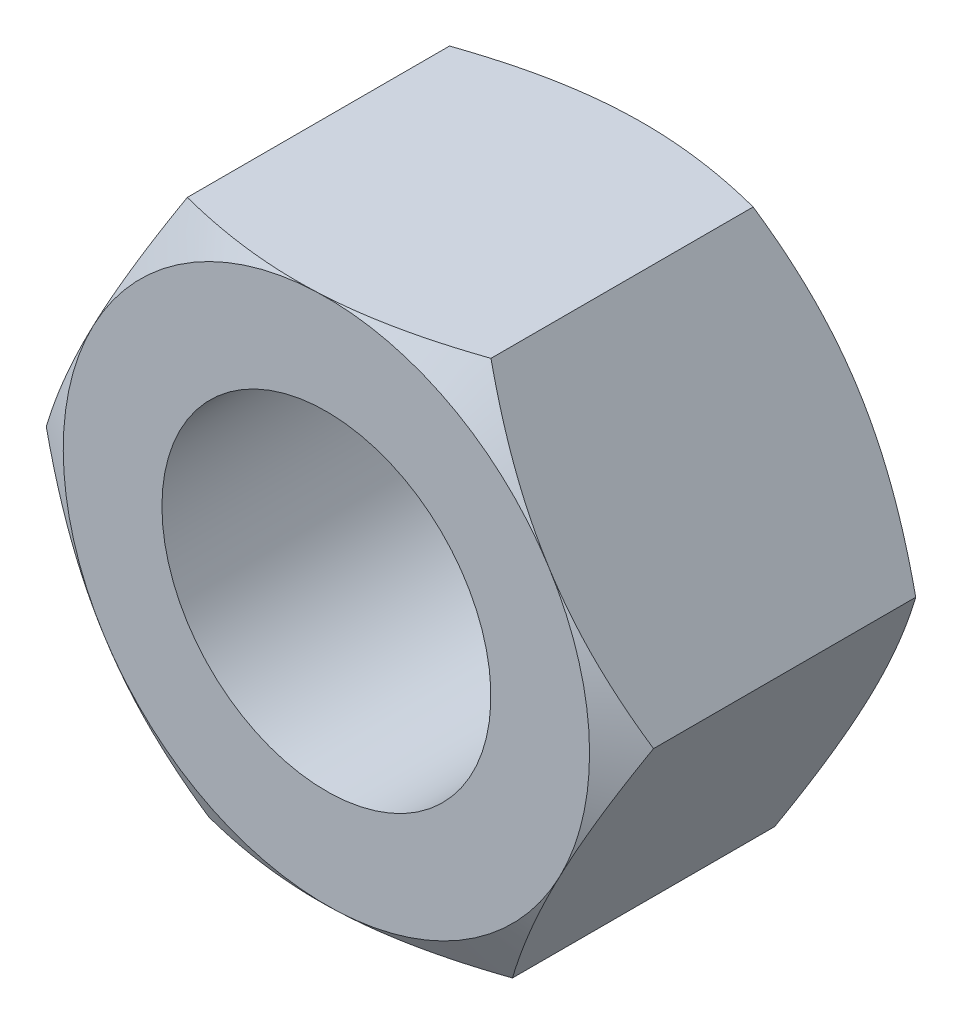
ISO-10303-21;
HEADER;
FILE_DESCRIPTION(('STEP AP214'),'2;1');
FILE_NAME('part.step','',(''),(''),'','','');
FILE_SCHEMA(('AUTOMOTIVE_DESIGN { 1 0 10303 214 1 1 1 1 }'));
ENDSEC;
DATA;
#1=APPLICATION_CONTEXT('core data for automotive mechanical design processes');
#2=APPLICATION_PROTOCOL_DEFINITION('international standard','automotive_design',2000,#1);
#3=PRODUCT_CONTEXT('',#1,'mechanical');
#4=PRODUCT('Part','Part','',(#3));
#5=PRODUCT_RELATED_PRODUCT_CATEGORY('part','',(#4));
#6=PRODUCT_DEFINITION_FORMATION('','',#4);
#7=PRODUCT_DEFINITION_CONTEXT('part definition',#1,'design');
#8=PRODUCT_DEFINITION('design','',#6,#7);
#9=PRODUCT_DEFINITION_SHAPE('','',#8);
#10=(LENGTH_UNIT() NAMED_UNIT(*) SI_UNIT(.MILLI.,.METRE.));
#11=(NAMED_UNIT(*) PLANE_ANGLE_UNIT() SI_UNIT($,.RADIAN.));
#12=(NAMED_UNIT(*) SI_UNIT($,.STERADIAN.) SOLID_ANGLE_UNIT());
#13=UNCERTAINTY_MEASURE_WITH_UNIT(LENGTH_MEASURE(1.E-05),#10,'distance_accuracy_value','');
#14=(GEOMETRIC_REPRESENTATION_CONTEXT(3) GLOBAL_UNCERTAINTY_ASSIGNED_CONTEXT((#13)) GLOBAL_UNIT_ASSIGNED_CONTEXT((#10,
#11,#12)) REPRESENTATION_CONTEXT('',''));
#15=CARTESIAN_POINT('',(0.,0.,0.));
#16=DIRECTION('',(0.,0.,1.));
#17=DIRECTION('',(1.,0.,0.));
#18=AXIS2_PLACEMENT_3D('',#15,#16,#17);
#19=CARTESIAN_POINT('',(4.61494220668174,0.188790260132153,4.7));
#20=DIRECTION('',(-0.844864518595137,-0.534980322272704,0.));
#21=DIRECTION('',(0.534980322272704,-0.844864518595138,0.));
#22=AXIS2_PLACEMENT_3D('',#19,#20,#21);
#23=PLANE('',#22);
#24=CARTESIAN_POINT('',(2.14384729921284,4.09125231804948,0.357333928967126));
#25=CARTESIAN_POINT('',(2.25243352694387,3.91976815835495,0.298719406394974));
#26=CARTESIAN_POINT('',(2.36195706473344,3.74680375727882,0.245411708536282));
#27=CARTESIAN_POINT('',(2.58290064132369,3.39787991709043,0.152362755477849));
#28=CARTESIAN_POINT('',(2.69432460587675,3.2219142782569,0.112654417281357));
#29=CARTESIAN_POINT('',(2.91579164946954,2.8721637558922,0.0508428341836271));
#30=CARTESIAN_POINT('',(3.02580065380855,2.69843268463118,0.0283281966138799));
#31=CARTESIAN_POINT('',(3.2463362723465,2.35015310979073,0.00145079094734091));
#32=CARTESIAN_POINT('',(3.356862084999,2.17560587204879,-0.00293423437598234));
#33=CARTESIAN_POINT('',(3.56338440128883,1.84945672213217,0.00618987017013602));
#34=CARTESIAN_POINT('',(3.65941182607072,1.69780597792231,0.0174587234235545));
#35=CARTESIAN_POINT('',(3.85084105988719,1.39549248948163,0.0531738354997763));
#36=CARTESIAN_POINT('',(3.94624220684292,1.24483079083491,0.077632293772679));
#37=CARTESIAN_POINT('',(4.13806610709027,0.941894027761016,0.138776335636239));
#38=CARTESIAN_POINT('',(4.2344645829404,0.789657303340137,0.175721097819675));
#39=CARTESIAN_POINT('',(4.42582380238389,0.487454384685015,0.259571098513502));
#40=CARTESIAN_POINT('',(4.52078699743012,0.337484319008298,0.306456636109196));
#41=CARTESIAN_POINT('',(4.61506884954826,0.188590260132153,0.357333928967125));
#42=B_SPLINE_CURVE_WITH_KNOTS('',3,(#24,#25,#26,#27,#28,#29,#30,#31,#32,#33,#34,#35,#36,#37,#38,
#39,#40,#41),.UNSPECIFIED.,.F.,.F.,(4,2,2,2,2,2,2,2,4),(0.,0.634048231759833,1.26962049521936,
1.88946273332481,2.50854378178384,3.04758232875476,3.58712030547103,4.13862588098487,
4.68904851608269),.UNSPECIFIED.);
#43=CARTESIAN_POINT('',(2.14397394207936,4.09105231804948,0.357265589908162));
#44=VERTEX_POINT('',#43);
#45=CARTESIAN_POINT('',(3.37945807438055,2.13992128909082,0.));
#46=VERTEX_POINT('',#45);
#47=EDGE_CURVE('E129',#44,#46,#42,.T.);
#48=ORIENTED_EDGE('',*,*,#47,.F.);
#49=DIRECTION('',(0.,0.,-1.));
#50=VECTOR('',#49,1.);
#51=CARTESIAN_POINT('',(2.14397394207936,4.09105231804948,4.7));
#52=LINE('',#51,#50);
#53=CARTESIAN_POINT('',(2.14397394207936,4.09105231804948,4.34273441009184));
#54=VERTEX_POINT('',#53);
#55=EDGE_CURVE('E336',#54,#44,#52,.T.);
#56=ORIENTED_EDGE('',*,*,#55,.F.);
#57=CARTESIAN_POINT('',(4.61506884954826,0.188590260132153,4.34266607103287));
#58=CARTESIAN_POINT('',(4.50648262181723,0.360074419826682,4.40128059360503));
#59=CARTESIAN_POINT('',(4.39695908402766,0.533038820902816,4.45458829146372));
#60=CARTESIAN_POINT('',(4.17601550743741,0.881962661091204,4.54763724452215));
#61=CARTESIAN_POINT('',(4.06459154288435,1.05792829992473,4.58734558271864));
#62=CARTESIAN_POINT('',(3.84312449929156,1.40767882228943,4.64915716581637));
#63=CARTESIAN_POINT('',(3.73311549495255,1.58140989355046,4.67167180338612));
#64=CARTESIAN_POINT('',(3.5125798764146,1.92968946839091,4.69854920905266));
#65=CARTESIAN_POINT('',(3.4020540637621,2.10423670613285,4.70293423437598));
#66=CARTESIAN_POINT('',(3.19553174747227,2.43038585604946,4.69381012982986));
#67=CARTESIAN_POINT('',(3.09950432269037,2.58203660025932,4.68254127657644));
#68=CARTESIAN_POINT('',(2.90807508887391,2.88435008870001,4.64682616450022));
#69=CARTESIAN_POINT('',(2.81267394191818,3.03501178734672,4.62236770622732));
#70=CARTESIAN_POINT('',(2.62085004167083,3.33794855042062,4.56122366436376));
#71=CARTESIAN_POINT('',(2.5244515658207,3.4901852748415,4.52427890218032));
#72=CARTESIAN_POINT('',(2.33309234637721,3.79238819349662,4.4404289014865));
#73=CARTESIAN_POINT('',(2.23812915133098,3.94235825917334,4.3935433638908));
#74=CARTESIAN_POINT('',(2.14384729921284,4.09125231804948,4.34266607103287));
#75=B_SPLINE_CURVE_WITH_KNOTS('',3,(#57,#58,#59,#60,#61,#62,#63,#64,#65,#66,#67,#68,#69,#70,#71,
#72,#73,#74),.UNSPECIFIED.,.F.,.F.,(4,2,2,2,2,2,2,2,4),(0.,0.634048231759834,1.26962049521936,
1.88946273332481,2.50854378178384,3.04758232875476,3.58712030547103,4.13862588098487,
4.68904851608269),.UNSPECIFIED.);
#76=CARTESIAN_POINT('',(3.37945807438055,2.13992128909082,4.7));
#77=VERTEX_POINT('',#76);
#78=EDGE_CURVE('E304',#77,#54,#75,.T.);
#79=ORIENTED_EDGE('',*,*,#78,.F.);
#80=CARTESIAN_POINT('',(4.61494220668174,0.188790260132153,4.34273441009184));
#81=VERTEX_POINT('',#80);
#82=EDGE_CURVE('E341',#81,#77,#75,.T.);
#83=ORIENTED_EDGE('',*,*,#82,.F.);
#84=DIRECTION('',(0.,0.,-1.));
#85=VECTOR('',#84,1.);
#86=CARTESIAN_POINT('',(4.61494220668174,0.188790260132153,4.7));
#87=LINE('',#86,#85);
#88=CARTESIAN_POINT('',(4.61494220668174,0.188790260132153,0.357265589908161));
#89=VERTEX_POINT('',#88);
#90=EDGE_CURVE('E159',#81,#89,#87,.T.);
#91=ORIENTED_EDGE('',*,*,#90,.T.);
#92=EDGE_CURVE('E141',#46,#89,#42,.T.);
#93=ORIENTED_EDGE('',*,*,#92,.F.);
#94=EDGE_LOOP('',(#48,#56,#79,#83,#91,#93));
#95=FACE_BOUND('',#94,.T.);
#96=ADVANCED_FACE('F40',(#95),#23,.F.);
#97=CARTESIAN_POINT('',(2.14397394207936,4.09105231804948,4.7));
#98=DIRECTION('',(0.0408742903153791,-0.999164296995851,0.));
#99=DIRECTION('',(0.999164296995852,0.0408742903153791,0.));
#100=AXIS2_PLACEMENT_3D('',#97,#98,#99);
#101=PLANE('',#100);
#102=CARTESIAN_POINT('',(-2.47116826460239,3.9022538762218,0.357323375102869));
#103=CARTESIAN_POINT('',(-2.26836612853849,3.91055020287296,0.298709719308242));
#104=CARTESIAN_POINT('',(-2.06381341476452,3.91891814299325,0.245402942118876));
#105=CARTESIAN_POINT('',(-1.65116601867302,3.93579891977485,0.152355899902409));
#106=CARTESIAN_POINT('',(-1.44306400475854,3.94431205636063,0.112648550677043));
#107=CARTESIAN_POINT('',(-1.02943898221529,3.96123282635208,0.0508389226971017));
#108=CARTESIAN_POINT('',(-0.823979611014162,3.96963785644747,0.0283252572392754));
#109=CARTESIAN_POINT('',(-0.412094222047382,3.98648746067763,0.00144973048013872));
#110=CARTESIAN_POINT('',(-0.205669701150405,3.99493197357779,-0.00293438725257586));
#111=CARTESIAN_POINT('',(0.180038732670287,4.01071071842333,0.00619115173106944));
#112=CARTESIAN_POINT('',(0.359380414977229,4.01804731362625,0.0174601806363879));
#113=CARTESIAN_POINT('',(0.7168953821797,4.03267270667268,0.0531748170069603));
#114=CARTESIAN_POINT('',(0.895067430706486,4.03996145393824,0.0776326220330986));
#115=CARTESIAN_POINT('',(1.25331939277193,4.05461699632255,0.138774624678206));
#116=CARTESIAN_POINT('',(1.43335396895206,4.06198193675899,0.175717974651983));
#117=CARTESIAN_POINT('',(1.79073810610036,4.07660197774708,0.259564614321253));
#118=CARTESIAN_POINT('',(1.96809224490068,4.08385726557087,0.306448205767898));
#119=CARTESIAN_POINT('',(2.14417394207935,4.09106049974501,0.357323375102869));
#120=B_SPLINE_CURVE_WITH_KNOTS('',3,(#102,#103,#104,#105,#106,#107,#108,#109,#110,#111,#112,
#113,#114,#115,#116,#117,#118,#119),.UNSPECIFIED.,.F.,.F.,(4,2,2,2,2,2,2,2,4),(0.,
0.63404572860114,1.2696154203531,1.88945539447948,2.50853420627714,3.04755657543962,
3.58707831335343,4.13856679076986,4.68897244903216),.UNSPECIFIED.);
#121=CARTESIAN_POINT('',(-2.47096826460239,3.90226205791733,0.357265589908162));
#122=VERTEX_POINT('',#121);
#123=CARTESIAN_POINT('',(-0.163497161261516,3.9966571879834,0.));
#124=VERTEX_POINT('',#123);
#125=EDGE_CURVE('E56',#122,#124,#120,.T.);
#126=ORIENTED_EDGE('',*,*,#125,.F.);
#127=DIRECTION('',(0.,0.,-1.));
#128=VECTOR('',#127,1.);
#129=CARTESIAN_POINT('',(-2.47096826460239,3.90226205791733,4.7));
#130=LINE('',#129,#128);
#131=CARTESIAN_POINT('',(-2.47096826460239,3.90226205791733,4.34273441009184));
#132=VERTEX_POINT('',#131);
#133=EDGE_CURVE('E300',#132,#122,#130,.T.);
#134=ORIENTED_EDGE('',*,*,#133,.F.);
#135=CARTESIAN_POINT('',(2.14417394207936,4.09106049974501,4.34267662489713));
#136=CARTESIAN_POINT('',(1.94137180601546,4.08276417309385,4.40129028069176));
#137=CARTESIAN_POINT('',(1.73681909224149,4.07439623297356,4.45459705788112));
#138=CARTESIAN_POINT('',(1.32417169614999,4.05751545619196,4.54764410009759));
#139=CARTESIAN_POINT('',(1.1160696822355,4.04900231960618,4.58735144932296));
#140=CARTESIAN_POINT('',(0.702444659692259,4.03208154961473,4.6491610773029));
#141=CARTESIAN_POINT('',(0.496985288491129,4.02367651951934,4.67167474276073));
#142=CARTESIAN_POINT('',(0.0850998995243492,4.00682691528918,4.69855026951986));
#143=CARTESIAN_POINT('',(-0.121324621372627,3.99838240238902,4.70293438725258));
#144=CARTESIAN_POINT('',(-0.507033055193319,3.98260365754348,4.69380884826893));
#145=CARTESIAN_POINT('',(-0.686374737500262,3.97526706234056,4.68253981936361));
#146=CARTESIAN_POINT('',(-1.04388970470273,3.96064166929413,4.64682518299304));
#147=CARTESIAN_POINT('',(-1.22206175322952,3.95335292202857,4.6223673779669));
#148=CARTESIAN_POINT('',(-1.58031371529497,3.93869737964426,4.56122537532179));
#149=CARTESIAN_POINT('',(-1.76034829147509,3.93133243920782,4.52428202534802));
#150=CARTESIAN_POINT('',(-2.11773242862339,3.91671239821973,4.44043538567875));
#151=CARTESIAN_POINT('',(-2.29508656742371,3.90945711039594,4.3935517942321));
#152=CARTESIAN_POINT('',(-2.47116826460239,3.9022538762218,4.34267662489713));
#153=B_SPLINE_CURVE_WITH_KNOTS('',3,(#135,#136,#137,#138,#139,#140,#141,#142,#143,#144,#145,
#146,#147,#148,#149,#150,#151,#152),.UNSPECIFIED.,.F.,.F.,(4,2,2,2,2,2,2,2,4),(0.,
0.634045728601139,1.2696154203531,1.88945539447948,2.50853420627714,3.04755657543962,
3.58707831335343,4.13856679076986,4.68897244903216),.UNSPECIFIED.);
#154=CARTESIAN_POINT('',(-0.163497161261516,3.9966571879834,4.7));
#155=VERTEX_POINT('',#154);
#156=EDGE_CURVE('E266',#155,#132,#153,.T.);
#157=ORIENTED_EDGE('',*,*,#156,.F.);
#158=EDGE_CURVE('E298',#54,#155,#153,.T.);
#159=ORIENTED_EDGE('',*,*,#158,.F.);
#160=ORIENTED_EDGE('',*,*,#55,.T.);
#161=EDGE_CURVE('E135',#124,#44,#120,.T.);
#162=ORIENTED_EDGE('',*,*,#161,.F.);
#163=EDGE_LOOP('',(#126,#134,#157,#159,#160,#162));
#164=FACE_BOUND('',#163,.T.);
#165=ADVANCED_FACE('F259',(#164),#101,.F.);
#166=CARTESIAN_POINT('',(-2.47096826460239,3.90226205791733,4.7));
#167=DIRECTION('',(0.885738808910517,-0.464183974723147,0.));
#168=DIRECTION('',(0.464183974723147,0.885738808910517,0.));
#169=AXIS2_PLACEMENT_3D('',#166,#167,#168);
#170=PLANE('',#169);
#171=CARTESIAN_POINT('',(-4.61504701951597,-0.188990260132153,0.35733077520112));
#172=CARTESIAN_POINT('',(-4.52083058031792,-0.00920991186649541,0.298716511643126));
#173=CARTESIAN_POINT('',(-4.42580087005857,0.172122290363084,0.24540908890275));
#174=CARTESIAN_POINT('',(-4.23409592948731,0.537926615738878,0.152360706850358));
#175=CARTESIAN_POINT('',(-4.13741729299034,0.722405238442282,0.112652664182551));
#176=CARTESIAN_POINT('',(-3.94525816298791,1.08907623140612,0.0508416653218663));
#177=CARTESIAN_POINT('',(-3.84980723454805,1.27121218669442,0.0283273182430339));
#178=CARTESIAN_POINT('',(-3.65845627592866,1.63634105671305,0.00145047404049512));
#179=CARTESIAN_POINT('',(-3.56255694120224,1.81933264440532,-0.00293428007213801));
#180=CARTESIAN_POINT('',(-3.38336550714625,2.16125915632848,0.00619025312402728));
#181=CARTESIAN_POINT('',(-3.30004657596457,2.32024528011394,0.0174591588698396));
#182=CARTESIAN_POINT('',(-3.1339515327635,2.63718174009967,0.0531741287974298));
#183=CARTESIAN_POINT('',(-3.05117599518306,2.79513098017664,0.0776323918647421));
#184=CARTESIAN_POINT('',(-2.88473852880529,3.11272083948932,0.13877582435885));
#185=CARTESIAN_POINT('',(-2.80109766404282,3.27232126510752,0.175720164537686));
#186=CARTESIAN_POINT('',(-2.63506337914797,3.58914178832524,0.259569160870541));
#187=CARTESIAN_POINT('',(-2.55266783206638,3.74636594449113,0.306454116906509));
#188=CARTESIAN_POINT('',(-2.47086345176816,3.90246205791733,0.35733077520112));
#189=B_SPLINE_CURVE_WITH_KNOTS('',3,(#171,#172,#173,#174,#175,#176,#177,#178,#179,#180,#181,
#182,#183,#184,#185,#186,#187,#188),.UNSPECIFIED.,.F.,.F.,(4,2,2,2,2,2,2,2,4),(0.,
0.634047483751844,1.26961897871922,1.88946054028946,2.50854092037654,3.04757463302549,
3.58710775719284,4.13860822337579,4.68902578537962),.UNSPECIFIED.);
#190=CARTESIAN_POINT('',(-4.61494220668174,-0.188790260132153,0.357265589908161));
#191=VERTEX_POINT('',#190);
#192=CARTESIAN_POINT('',(-3.54295523564207,1.85673589889259,0.));
#193=VERTEX_POINT('',#192);
#194=EDGE_CURVE('E63',#191,#193,#189,.T.);
#195=ORIENTED_EDGE('',*,*,#194,.F.);
#196=DIRECTION('',(0.,0.,-1.));
#197=VECTOR('',#196,1.);
#198=CARTESIAN_POINT('',(-4.61494220668174,-0.188790260132153,4.7));
#199=LINE('',#198,#197);
#200=CARTESIAN_POINT('',(-4.61494220668174,-0.188790260132153,4.34273441009184));
#201=VERTEX_POINT('',#200);
#202=EDGE_CURVE('E327',#201,#191,#199,.T.);
#203=ORIENTED_EDGE('',*,*,#202,.F.);
#204=CARTESIAN_POINT('',(-2.47086345176816,3.90246205791733,4.34266922479888));
#205=CARTESIAN_POINT('',(-2.56507989096621,3.72268170965167,4.40128348835687));
#206=CARTESIAN_POINT('',(-2.66010960122556,3.54134950742209,4.45459091109725));
#207=CARTESIAN_POINT('',(-2.85181454179682,3.1755451820463,4.54763929314964));
#208=CARTESIAN_POINT('',(-2.94849317829379,2.99106655934289,4.58734733581745));
#209=CARTESIAN_POINT('',(-3.14065230829622,2.62439556637906,4.64915833467813));
#210=CARTESIAN_POINT('',(-3.23610323673608,2.44225961109076,4.67167268175697));
#211=CARTESIAN_POINT('',(-3.42745419535547,2.07713074107212,4.69854952595951));
#212=CARTESIAN_POINT('',(-3.52335353008189,1.89413915337985,4.70293428007214));
#213=CARTESIAN_POINT('',(-3.70254496413788,1.55221264145669,4.69380974687597));
#214=CARTESIAN_POINT('',(-3.78586389531956,1.39322651767123,4.68254084113016));
#215=CARTESIAN_POINT('',(-3.95195893852063,1.0762900576855,4.64682587120257));
#216=CARTESIAN_POINT('',(-4.03473447610107,0.918340817608539,4.62236760813526));
#217=CARTESIAN_POINT('',(-4.20117194247884,0.600750958295854,4.56122417564115));
#218=CARTESIAN_POINT('',(-4.28481280724131,0.441150532677659,4.52427983546231));
#219=CARTESIAN_POINT('',(-4.45084709213616,0.124330009459939,4.44043083912946));
#220=CARTESIAN_POINT('',(-4.53324263921775,-0.0328941467059542,4.39354588309349));
#221=CARTESIAN_POINT('',(-4.61504701951597,-0.188990260132154,4.34266922479888));
#222=B_SPLINE_CURVE_WITH_KNOTS('',3,(#204,#205,#206,#207,#208,#209,#210,#211,#212,#213,#214,
#215,#216,#217,#218,#219,#220,#221),.UNSPECIFIED.,.F.,.F.,(4,2,2,2,2,2,2,2,4),(0.,
0.634047483751845,1.26961897871922,1.88946054028946,2.50854092037654,3.04757463302549,
3.58710775719284,4.13860822337579,4.68902578537962),.UNSPECIFIED.);
#223=CARTESIAN_POINT('',(-3.54295523564207,1.85673589889259,4.7));
#224=VERTEX_POINT('',#223);
#225=EDGE_CURVE('E245',#224,#201,#222,.T.);
#226=ORIENTED_EDGE('',*,*,#225,.F.);
#227=EDGE_CURVE('E303',#132,#224,#222,.T.);
#228=ORIENTED_EDGE('',*,*,#227,.F.);
#229=ORIENTED_EDGE('',*,*,#133,.T.);
#230=EDGE_CURVE('E196',#193,#122,#189,.T.);
#231=ORIENTED_EDGE('',*,*,#230,.F.);
#232=EDGE_LOOP('',(#195,#203,#226,#228,#229,#231));
#233=FACE_BOUND('',#232,.T.);
#234=ADVANCED_FACE('F254',(#233),#170,.F.);
#235=CARTESIAN_POINT('',(-4.61494220668174,-0.188790260132153,4.7));
#236=DIRECTION('',(0.844864518595137,0.534980322272704,0.));
#237=DIRECTION('',(-0.534980322272704,0.844864518595137,0.));
#238=AXIS2_PLACEMENT_3D('',#235,#236,#237);
#239=PLANE('',#238);
#240=CARTESIAN_POINT('',(-2.14384729921284,-4.09125231804948,0.357333928967126));
#241=CARTESIAN_POINT('',(-2.25243352694387,-3.91976815835495,0.298719406394974));
#242=CARTESIAN_POINT('',(-2.36195706473343,-3.74680375727882,0.245411708536282));
#243=CARTESIAN_POINT('',(-2.58290064132369,-3.39787991709043,0.152362755477849));
#244=CARTESIAN_POINT('',(-2.69432460587675,-3.2219142782569,0.112654417281357));
#245=CARTESIAN_POINT('',(-2.91579164946954,-2.8721637558922,0.0508428341836271));
#246=CARTESIAN_POINT('',(-3.02580065380855,-2.69843268463118,0.0283281966138797));
#247=CARTESIAN_POINT('',(-3.2463362723465,-2.35015310979073,0.00145079094734056));
#248=CARTESIAN_POINT('',(-3.356862084999,-2.17560587204879,-0.00293423437598268));
#249=CARTESIAN_POINT('',(-3.56338440128883,-1.84945672213217,0.00618987017013537));
#250=CARTESIAN_POINT('',(-3.65941182607072,-1.69780597792232,0.0174587234235536));
#251=CARTESIAN_POINT('',(-3.85084105988719,-1.39549248948163,0.0531738354997755));
#252=CARTESIAN_POINT('',(-3.94624220684292,-1.24483079083491,0.0776322937726786));
#253=CARTESIAN_POINT('',(-4.13806610709027,-0.941894027761017,0.138776335636239));
#254=CARTESIAN_POINT('',(-4.2344645829404,-0.789657303340137,0.175721097819675));
#255=CARTESIAN_POINT('',(-4.42582380238389,-0.487454384685014,0.259571098513502));
#256=CARTESIAN_POINT('',(-4.52078699743012,-0.337484319008297,0.306456636109195));
#257=CARTESIAN_POINT('',(-4.61506884954826,-0.188590260132153,0.357333928967125));
#258=B_SPLINE_CURVE_WITH_KNOTS('',3,(#240,#241,#242,#243,#244,#245,#246,#247,#248,#249,#250,
#251,#252,#253,#254,#255,#256,#257),.UNSPECIFIED.,.F.,.F.,(4,2,2,2,2,2,2,2,4),(0.,
0.634048231759834,1.26962049521936,1.88946273332481,2.50854378178384,3.04758232875476,
3.58712030547103,4.13862588098487,4.68904851608269),.UNSPECIFIED.);
#259=CARTESIAN_POINT('',(-2.14397394207935,-4.09105231804948,0.357265589908162));
#260=VERTEX_POINT('',#259);
#261=CARTESIAN_POINT('',(-3.37945807438055,-2.13992128909082,0.));
#262=VERTEX_POINT('',#261);
#263=EDGE_CURVE('E174',#260,#262,#258,.T.);
#264=ORIENTED_EDGE('',*,*,#263,.F.);
#265=DIRECTION('',(0.,0.,-1.));
#266=VECTOR('',#265,1.);
#267=CARTESIAN_POINT('',(-2.14397394207935,-4.09105231804948,4.7));
#268=LINE('',#267,#266);
#269=CARTESIAN_POINT('',(-2.14397394207935,-4.09105231804948,4.34273441009184));
#270=VERTEX_POINT('',#269);
#271=EDGE_CURVE('E324',#270,#260,#268,.T.);
#272=ORIENTED_EDGE('',*,*,#271,.F.);
#273=CARTESIAN_POINT('',(-4.61506884954826,-0.188590260132153,4.34266607103288));
#274=CARTESIAN_POINT('',(-4.50648262181723,-0.360074419826682,4.40128059360503));
#275=CARTESIAN_POINT('',(-4.39695908402766,-0.533038820902817,4.45458829146372));
#276=CARTESIAN_POINT('',(-4.17601550743741,-0.881962661091204,4.54763724452215));
#277=CARTESIAN_POINT('',(-4.06459154288435,-1.05792829992473,4.58734558271864));
#278=CARTESIAN_POINT('',(-3.84312449929155,-1.40767882228943,4.64915716581637));
#279=CARTESIAN_POINT('',(-3.73311549495255,-1.58140989355046,4.67167180338612));
#280=CARTESIAN_POINT('',(-3.5125798764146,-1.92968946839091,4.69854920905266));
#281=CARTESIAN_POINT('',(-3.4020540637621,-2.10423670613284,4.70293423437598));
#282=CARTESIAN_POINT('',(-3.19553174747227,-2.43038585604946,4.69381012982986));
#283=CARTESIAN_POINT('',(-3.09950432269037,-2.58203660025932,4.68254127657645));
#284=CARTESIAN_POINT('',(-2.90807508887391,-2.88435008870001,4.64682616450022));
#285=CARTESIAN_POINT('',(-2.81267394191818,-3.03501178734672,4.62236770622732));
#286=CARTESIAN_POINT('',(-2.62085004167083,-3.33794855042062,4.56122366436376));
#287=CARTESIAN_POINT('',(-2.5244515658207,-3.4901852748415,4.52427890218032));
#288=CARTESIAN_POINT('',(-2.33309234637721,-3.79238819349662,4.4404289014865));
#289=CARTESIAN_POINT('',(-2.23812915133098,-3.94235825917334,4.3935433638908));
#290=CARTESIAN_POINT('',(-2.14384729921284,-4.09125231804948,4.34266607103287));
#291=B_SPLINE_CURVE_WITH_KNOTS('',3,(#273,#274,#275,#276,#277,#278,#279,#280,#281,#282,#283,
#284,#285,#286,#287,#288,#289,#290),.UNSPECIFIED.,.F.,.F.,(4,2,2,2,2,2,2,2,4),(0.,
0.634048231759834,1.26962049521936,1.88946273332481,2.50854378178384,3.04758232875476,
3.58712030547103,4.13862588098487,4.68904851608269),.UNSPECIFIED.);
#292=CARTESIAN_POINT('',(-3.37945807438055,-2.13992128909082,4.7));
#293=VERTEX_POINT('',#292);
#294=EDGE_CURVE('E238',#293,#270,#291,.T.);
#295=ORIENTED_EDGE('',*,*,#294,.F.);
#296=EDGE_CURVE('E244',#201,#293,#291,.T.);
#297=ORIENTED_EDGE('',*,*,#296,.F.);
#298=ORIENTED_EDGE('',*,*,#202,.T.);
#299=EDGE_CURVE('E276',#262,#191,#258,.T.);
#300=ORIENTED_EDGE('',*,*,#299,.F.);
#301=EDGE_LOOP('',(#264,#272,#295,#297,#298,#300));
#302=FACE_BOUND('',#301,.T.);
#303=ADVANCED_FACE('F251',(#302),#239,.F.);
#304=CARTESIAN_POINT('',(-2.14397394207935,-4.09105231804948,4.7));
#305=DIRECTION('',(-0.0408742903153787,0.999164296995851,0.));
#306=DIRECTION('',(-0.999164296995852,-0.0408742903153787,0.));
#307=AXIS2_PLACEMENT_3D('',#304,#305,#306);
#308=PLANE('',#307);
#309=CARTESIAN_POINT('',(2.47116826460239,-3.9022538762218,0.357323375102871));
#310=CARTESIAN_POINT('',(2.26836612853849,-3.91055020287296,0.298709719308244));
#311=CARTESIAN_POINT('',(2.06381341476452,-3.91891814299325,0.245402942118878));
#312=CARTESIAN_POINT('',(1.65116601867302,-3.93579891977485,0.152355899902411));
#313=CARTESIAN_POINT('',(1.44306400475854,-3.94431205636063,0.112648550677045));
#314=CARTESIAN_POINT('',(1.02943898221529,-3.96123282635208,0.0508389226971028));
#315=CARTESIAN_POINT('',(0.823979611014163,-3.96963785644747,0.0283252572392765));
#316=CARTESIAN_POINT('',(0.412094222047383,-3.98648746067763,0.00144973048013988));
#317=CARTESIAN_POINT('',(0.205669701150406,-3.99493197357779,-0.00293438725257466));
#318=CARTESIAN_POINT('',(-0.180038732670286,-4.01071071842334,0.00619115173107025));
#319=CARTESIAN_POINT('',(-0.359380414977229,-4.01804731362625,0.0174601806363883));
#320=CARTESIAN_POINT('',(-0.716895382179699,-4.03267270667268,0.0531748170069606));
#321=CARTESIAN_POINT('',(-0.895067430706485,-4.03996145393824,0.0776326220330992));
#322=CARTESIAN_POINT('',(-1.25331939277193,-4.05461699632255,0.138774624678207));
#323=CARTESIAN_POINT('',(-1.43335396895206,-4.06198193675899,0.175717974651983));
#324=CARTESIAN_POINT('',(-1.79073810610036,-4.07660197774708,0.259564614321253));
#325=CARTESIAN_POINT('',(-1.96809224490068,-4.08385726557087,0.306448205767898));
#326=CARTESIAN_POINT('',(-2.14417394207935,-4.09106049974501,0.357323375102869));
#327=B_SPLINE_CURVE_WITH_KNOTS('',3,(#309,#310,#311,#312,#313,#314,#315,#316,#317,#318,#319,
#320,#321,#322,#323,#324,#325,#326),.UNSPECIFIED.,.F.,.F.,(4,2,2,2,2,2,2,2,4),(0.,
0.63404572860114,1.2696154203531,1.88945539447948,2.50853420627715,3.04755657543962,
3.58707831335344,4.13856679076986,4.68897244903216),.UNSPECIFIED.);
#328=CARTESIAN_POINT('',(2.47096826460239,-3.90226205791733,0.357265589908164));
#329=VERTEX_POINT('',#328);
#330=CARTESIAN_POINT('',(0.163497161261515,-3.9966571879834,0.));
#331=VERTEX_POINT('',#330);
#332=EDGE_CURVE('E160',#329,#331,#327,.T.);
#333=ORIENTED_EDGE('',*,*,#332,.F.);
#334=DIRECTION('',(0.,0.,-1.));
#335=VECTOR('',#334,1.);
#336=CARTESIAN_POINT('',(2.47096826460239,-3.90226205791733,4.7));
#337=LINE('',#336,#335);
#338=CARTESIAN_POINT('',(2.47096826460239,-3.90226205791733,4.34273441009184));
#339=VERTEX_POINT('',#338);
#340=EDGE_CURVE('E328',#339,#329,#337,.T.);
#341=ORIENTED_EDGE('',*,*,#340,.F.);
#342=CARTESIAN_POINT('',(-2.14417394207935,-4.09106049974501,4.34267662489713));
#343=CARTESIAN_POINT('',(-1.94137180601546,-4.08276417309385,4.40129028069176));
#344=CARTESIAN_POINT('',(-1.73681909224149,-4.07439623297356,4.45459705788112));
#345=CARTESIAN_POINT('',(-1.32417169614999,-4.05751545619196,4.54764410009759));
#346=CARTESIAN_POINT('',(-1.1160696822355,-4.04900231960619,4.58735144932296));
#347=CARTESIAN_POINT('',(-0.702444659692257,-4.03208154961473,4.6491610773029));
#348=CARTESIAN_POINT('',(-0.496985288491127,-4.02367651951934,4.67167474276072));
#349=CARTESIAN_POINT('',(-0.0850998995243476,-4.00682691528918,4.69855026951986));
#350=CARTESIAN_POINT('',(0.121324621372629,-3.99838240238902,4.70293438725257));
#351=CARTESIAN_POINT('',(0.507033055193321,-3.98260365754348,4.69380884826893));
#352=CARTESIAN_POINT('',(0.686374737500264,-3.97526706234056,4.68253981936361));
#353=CARTESIAN_POINT('',(1.04388970470273,-3.96064166929413,4.64682518299304));
#354=CARTESIAN_POINT('',(1.22206175322952,-3.95335292202858,4.6223673779669));
#355=CARTESIAN_POINT('',(1.58031371529497,-3.93869737964426,4.56122537532179));
#356=CARTESIAN_POINT('',(1.76034829147509,-3.93133243920782,4.52428202534802));
#357=CARTESIAN_POINT('',(2.11773242862339,-3.91671239821973,4.44043538567875));
#358=CARTESIAN_POINT('',(2.29508656742371,-3.90945711039595,4.3935517942321));
#359=CARTESIAN_POINT('',(2.47116826460239,-3.9022538762218,4.34267662489713));
#360=B_SPLINE_CURVE_WITH_KNOTS('',3,(#342,#343,#344,#345,#346,#347,#348,#349,#350,#351,#352,
#353,#354,#355,#356,#357,#358,#359),.UNSPECIFIED.,.F.,.F.,(4,2,2,2,2,2,2,2,4),(0.,
0.634045728601139,1.2696154203531,1.88945539447948,2.50853420627714,3.04755657543962,
3.58707831335343,4.13856679076986,4.68897244903216),.UNSPECIFIED.);
#361=CARTESIAN_POINT('',(0.163497161261515,-3.9966571879834,4.7));
#362=VERTEX_POINT('',#361);
#363=EDGE_CURVE('E231',#362,#339,#360,.T.);
#364=ORIENTED_EDGE('',*,*,#363,.F.);
#365=EDGE_CURVE('E237',#270,#362,#360,.T.);
#366=ORIENTED_EDGE('',*,*,#365,.F.);
#367=ORIENTED_EDGE('',*,*,#271,.T.);
#368=EDGE_CURVE('E140',#331,#260,#327,.T.);
#369=ORIENTED_EDGE('',*,*,#368,.F.);
#370=EDGE_LOOP('',(#333,#341,#364,#366,#367,#369));
#371=FACE_BOUND('',#370,.T.);
#372=ADVANCED_FACE('F218',(#371),#308,.F.);
#373=CARTESIAN_POINT('',(2.47096826460239,-3.90226205791733,4.7));
#374=DIRECTION('',(-0.885738808910517,0.464183974723147,0.));
#375=DIRECTION('',(-0.464183974723147,-0.885738808910517,0.));
#376=AXIS2_PLACEMENT_3D('',#373,#374,#375);
#377=PLANE('',#376);
#378=CARTESIAN_POINT('',(4.61504701951597,0.188990260132153,0.357330775201121));
#379=CARTESIAN_POINT('',(4.52083058031792,0.00920991186649465,0.298716511643128));
#380=CARTESIAN_POINT('',(4.42580087005858,-0.172122290363085,0.245409088902752));
#381=CARTESIAN_POINT('',(4.23409592948731,-0.53792661573888,0.15236070685036));
#382=CARTESIAN_POINT('',(4.13741729299034,-0.722405238442283,0.112652664182552));
#383=CARTESIAN_POINT('',(3.94525816298791,-1.08907623140612,0.0508416653218673));
#384=CARTESIAN_POINT('',(3.84980723454805,-1.27121218669442,0.028327318243035));
#385=CARTESIAN_POINT('',(3.65845627592867,-1.63634105671305,0.00145047404049621));
#386=CARTESIAN_POINT('',(3.56255694120224,-1.81933264440532,-0.00293428007213695));
#387=CARTESIAN_POINT('',(3.38336550714625,-2.16125915632848,0.00619025312402881));
#388=CARTESIAN_POINT('',(3.30004657596457,-2.32024528011394,0.0174591588698415));
#389=CARTESIAN_POINT('',(3.1339515327635,-2.63718174009967,0.0531741287974318));
#390=CARTESIAN_POINT('',(3.05117599518306,-2.79513098017664,0.0776323918647436));
#391=CARTESIAN_POINT('',(2.88473852880529,-3.11272083948932,0.138775824358851));
#392=CARTESIAN_POINT('',(2.80109766404282,-3.27232126510752,0.175720164537688));
#393=CARTESIAN_POINT('',(2.63506337914797,-3.58914178832524,0.259569160870543));
#394=CARTESIAN_POINT('',(2.55266783206639,-3.74636594449113,0.306454116906512));
#395=CARTESIAN_POINT('',(2.47086345176817,-3.90246205791733,0.357330775201122));
#396=B_SPLINE_CURVE_WITH_KNOTS('',3,(#378,#379,#380,#381,#382,#383,#384,#385,#386,#387,#388,
#389,#390,#391,#392,#393,#394,#395),.UNSPECIFIED.,.F.,.F.,(4,2,2,2,2,2,2,2,4),(0.,
0.634047483751845,1.26961897871922,1.88946054028946,2.50854092037654,3.04757463302549,
3.58710775719284,4.13860822337579,4.68902578537962),.UNSPECIFIED.);
#397=CARTESIAN_POINT('',(3.54295523564207,-1.85673589889259,0.));
#398=VERTEX_POINT('',#397);
#399=EDGE_CURVE('E147',#89,#398,#396,.T.);
#400=ORIENTED_EDGE('',*,*,#399,.F.);
#401=ORIENTED_EDGE('',*,*,#90,.F.);
#402=CARTESIAN_POINT('',(2.47086345176817,-3.90246205791733,4.34266922479888));
#403=CARTESIAN_POINT('',(2.56507989096621,-3.72268170965167,4.40128348835687));
#404=CARTESIAN_POINT('',(2.66010960122556,-3.54134950742209,4.45459091109725));
#405=CARTESIAN_POINT('',(2.85181454179683,-3.1755451820463,4.54763929314964));
#406=CARTESIAN_POINT('',(2.94849317829379,-2.9910665593429,4.58734733581745));
#407=CARTESIAN_POINT('',(3.14065230829623,-2.62439556637906,4.64915833467813));
#408=CARTESIAN_POINT('',(3.23610323673608,-2.44225961109076,4.67167268175696));
#409=CARTESIAN_POINT('',(3.42745419535547,-2.07713074107212,4.6985495259595));
#410=CARTESIAN_POINT('',(3.5233535300819,-1.89413915337985,4.70293428007214));
#411=CARTESIAN_POINT('',(3.70254496413788,-1.5522126414567,4.69380974687597));
#412=CARTESIAN_POINT('',(3.78586389531956,-1.39322651767124,4.68254084113016));
#413=CARTESIAN_POINT('',(3.95195893852064,-1.0762900576855,4.64682587120257));
#414=CARTESIAN_POINT('',(4.03473447610108,-0.91834081760854,4.62236760813526));
#415=CARTESIAN_POINT('',(4.20117194247884,-0.600750958295854,4.56122417564115));
#416=CARTESIAN_POINT('',(4.28481280724132,-0.441150532677659,4.52427983546231));
#417=CARTESIAN_POINT('',(4.45084709213616,-0.124330009459939,4.44043083912946));
#418=CARTESIAN_POINT('',(4.53324263921775,0.0328941467059544,4.39354588309349));
#419=CARTESIAN_POINT('',(4.61504701951597,0.188990260132153,4.34266922479888));
#420=B_SPLINE_CURVE_WITH_KNOTS('',3,(#402,#403,#404,#405,#406,#407,#408,#409,#410,#411,#412,
#413,#414,#415,#416,#417,#418,#419),.UNSPECIFIED.,.F.,.F.,(4,2,2,2,2,2,2,2,4),(0.,
0.634047483751845,1.26961897871922,1.88946054028946,2.50854092037654,3.04757463302549,
3.58710775719284,4.13860822337579,4.68902578537962),.UNSPECIFIED.);
#421=CARTESIAN_POINT('',(3.54295523564207,-1.85673589889259,4.7));
#422=VERTEX_POINT('',#421);
#423=EDGE_CURVE('E223',#422,#81,#420,.T.);
#424=ORIENTED_EDGE('',*,*,#423,.F.);
#425=EDGE_CURVE('E229',#339,#422,#420,.T.);
#426=ORIENTED_EDGE('',*,*,#425,.F.);
#427=ORIENTED_EDGE('',*,*,#340,.T.);
#428=EDGE_CURVE('E205',#398,#329,#396,.T.);
#429=ORIENTED_EDGE('',*,*,#428,.F.);
#430=EDGE_LOOP('',(#400,#401,#424,#426,#427,#429));
#431=FACE_BOUND('',#430,.T.);
#432=ADVANCED_FACE('F214',(#431),#377,.F.);
#433=CARTESIAN_POINT('',(0.,0.,4.7));
#434=DIRECTION('',(0.,0.,-1.));
#435=DIRECTION('',(1.,0.,0.));
#436=AXIS2_PLACEMENT_3D('',#433,#434,#435);
#437=CONICAL_SURFACE('',#436,4.,1.0471975511966);
#438=ORIENTED_EDGE('',*,*,#82,.T.);
#439=CARTESIAN_POINT('',(0.,0.,4.7));
#440=DIRECTION('',(0.,0.,1.));
#441=DIRECTION('',(1.,0.,0.));
#442=AXIS2_PLACEMENT_3D('',#439,#440,#441);
#443=CIRCLE('',#442,4.);
#444=EDGE_CURVE('E292',#422,#77,#443,.T.);
#445=ORIENTED_EDGE('',*,*,#444,.F.);
#446=ORIENTED_EDGE('',*,*,#423,.T.);
#447=EDGE_LOOP('',(#438,#445,#446));
#448=FACE_BOUND('',#447,.T.);
#449=ADVANCED_FACE('F190',(#448),#437,.T.);
#450=ORIENTED_EDGE('',*,*,#363,.T.);
#451=ORIENTED_EDGE('',*,*,#425,.T.);
#452=EDGE_CURVE('E321',#362,#422,#443,.T.);
#453=ORIENTED_EDGE('',*,*,#452,.F.);
#454=EDGE_LOOP('',(#450,#451,#453));
#455=FACE_BOUND('',#454,.T.);
#456=ADVANCED_FACE('F343',(#455),#437,.T.);
#457=ORIENTED_EDGE('',*,*,#294,.T.);
#458=ORIENTED_EDGE('',*,*,#365,.T.);
#459=EDGE_CURVE('E316',#293,#362,#443,.T.);
#460=ORIENTED_EDGE('',*,*,#459,.F.);
#461=EDGE_LOOP('',(#457,#458,#460));
#462=FACE_BOUND('',#461,.T.);
#463=ADVANCED_FACE('F317',(#462),#437,.T.);
#464=ORIENTED_EDGE('',*,*,#225,.T.);
#465=ORIENTED_EDGE('',*,*,#296,.T.);
#466=EDGE_CURVE('E310',#224,#293,#443,.T.);
#467=ORIENTED_EDGE('',*,*,#466,.F.);
#468=EDGE_LOOP('',(#464,#465,#467));
#469=FACE_BOUND('',#468,.T.);
#470=ADVANCED_FACE('F309',(#469),#437,.T.);
#471=ORIENTED_EDGE('',*,*,#156,.T.);
#472=ORIENTED_EDGE('',*,*,#227,.T.);
#473=EDGE_CURVE('E152',#155,#224,#443,.T.);
#474=ORIENTED_EDGE('',*,*,#473,.F.);
#475=EDGE_LOOP('',(#471,#472,#474));
#476=FACE_BOUND('',#475,.T.);
#477=ADVANCED_FACE('F351',(#476),#437,.T.);
#478=ORIENTED_EDGE('',*,*,#78,.T.);
#479=ORIENTED_EDGE('',*,*,#158,.T.);
#480=CARTESIAN_POINT('',(0.,0.,4.7));
#481=DIRECTION('',(0.,0.,1.));
#482=DIRECTION('',(1.,0.,0.));
#483=AXIS2_PLACEMENT_3D('',#480,#481,#482);
#484=CIRCLE('',#483,4.);
#485=EDGE_CURVE('E230',#77,#155,#484,.T.);
#486=ORIENTED_EDGE('',*,*,#485,.F.);
#487=EDGE_LOOP('',(#478,#479,#486));
#488=FACE_BOUND('',#487,.T.);
#489=ADVANCED_FACE('F350',(#488),#437,.T.);
#490=CARTESIAN_POINT('',(0.,0.,4.7));
#491=DIRECTION('',(0.,0.,1.));
#492=DIRECTION('',(1.,0.,0.));
#493=AXIS2_PLACEMENT_3D('',#490,#491,#492);
#494=PLANE('',#493);
#495=CARTESIAN_POINT('',(0.,0.,4.7));
#496=DIRECTION('',(0.,0.,-1.));
#497=DIRECTION('',(-1.,0.,0.));
#498=AXIS2_PLACEMENT_3D('',#495,#496,#497);
#499=CIRCLE('',#498,2.5);
#500=CARTESIAN_POINT('',(-2.5,0.,4.7));
#501=VERTEX_POINT('',#500);
#502=EDGE_CURVE('E493',#501,#501,#499,.T.);
#503=ORIENTED_EDGE('',*,*,#502,.T.);
#504=EDGE_LOOP('',(#503));
#505=FACE_BOUND('',#504,.T.);
#506=ORIENTED_EDGE('',*,*,#444,.T.);
#507=ORIENTED_EDGE('',*,*,#485,.T.);
#508=ORIENTED_EDGE('',*,*,#473,.T.);
#509=ORIENTED_EDGE('',*,*,#466,.T.);
#510=ORIENTED_EDGE('',*,*,#459,.T.);
#511=ORIENTED_EDGE('',*,*,#452,.T.);
#512=EDGE_LOOP('',(#506,#507,#508,#509,#510,#511));
#513=FACE_BOUND('',#512,.T.);
#514=ADVANCED_FACE('F287',(#505,#513),#494,.T.);
#515=CARTESIAN_POINT('',(0.,0.,0.));
#516=DIRECTION('',(0.,0.,1.));
#517=DIRECTION('',(-1.,0.,0.));
#518=AXIS2_PLACEMENT_3D('',#515,#516,#517);
#519=CONICAL_SURFACE('',#518,4.,1.0471975511966);
#520=ORIENTED_EDGE('',*,*,#92,.T.);
#521=ORIENTED_EDGE('',*,*,#399,.T.);
#522=CARTESIAN_POINT('',(0.,0.,0.));
#523=DIRECTION('',(0.,0.,1.));
#524=DIRECTION('',(1.,0.,0.));
#525=AXIS2_PLACEMENT_3D('',#522,#523,#524);
#526=CIRCLE('',#525,4.);
#527=EDGE_CURVE('E44',#398,#46,#526,.T.);
#528=ORIENTED_EDGE('',*,*,#527,.T.);
#529=EDGE_LOOP('',(#520,#521,#528));
#530=FACE_BOUND('',#529,.T.);
#531=ADVANCED_FACE('F145',(#530),#519,.T.);
#532=ORIENTED_EDGE('',*,*,#332,.T.);
#533=EDGE_CURVE('E151',#331,#398,#526,.T.);
#534=ORIENTED_EDGE('',*,*,#533,.T.);
#535=ORIENTED_EDGE('',*,*,#428,.T.);
#536=EDGE_LOOP('',(#532,#534,#535));
#537=FACE_BOUND('',#536,.T.);
#538=ADVANCED_FACE('F188',(#537),#519,.T.);
#539=ORIENTED_EDGE('',*,*,#263,.T.);
#540=EDGE_CURVE('E500',#262,#331,#526,.T.);
#541=ORIENTED_EDGE('',*,*,#540,.T.);
#542=ORIENTED_EDGE('',*,*,#368,.T.);
#543=EDGE_LOOP('',(#539,#541,#542));
#544=FACE_BOUND('',#543,.T.);
#545=ADVANCED_FACE('F187',(#544),#519,.T.);
#546=ORIENTED_EDGE('',*,*,#194,.T.);
#547=EDGE_CURVE('E49',#193,#262,#526,.T.);
#548=ORIENTED_EDGE('',*,*,#547,.T.);
#549=ORIENTED_EDGE('',*,*,#299,.T.);
#550=EDGE_LOOP('',(#546,#548,#549));
#551=FACE_BOUND('',#550,.T.);
#552=ADVANCED_FACE('F181',(#551),#519,.T.);
#553=ORIENTED_EDGE('',*,*,#230,.T.);
#554=ORIENTED_EDGE('',*,*,#125,.T.);
#555=CARTESIAN_POINT('',(0.,0.,0.));
#556=DIRECTION('',(0.,0.,-1.));
#557=DIRECTION('',(-1.,0.,0.));
#558=AXIS2_PLACEMENT_3D('',#555,#556,#557);
#559=CIRCLE('',#558,4.);
#560=EDGE_CURVE('E155',#193,#124,#559,.T.);
#561=ORIENTED_EDGE('',*,*,#560,.F.);
#562=EDGE_LOOP('',(#553,#554,#561));
#563=FACE_BOUND('',#562,.T.);
#564=ADVANCED_FACE('F186',(#563),#519,.T.);
#565=ORIENTED_EDGE('',*,*,#161,.T.);
#566=ORIENTED_EDGE('',*,*,#47,.T.);
#567=EDGE_CURVE('E12',#46,#124,#526,.T.);
#568=ORIENTED_EDGE('',*,*,#567,.T.);
#569=EDGE_LOOP('',(#565,#566,#568));
#570=FACE_BOUND('',#569,.T.);
#571=ADVANCED_FACE('F131',(#570),#519,.T.);
#572=CARTESIAN_POINT('',(0.,0.,0.));
#573=DIRECTION('',(0.,0.,1.));
#574=DIRECTION('',(1.,0.,0.));
#575=AXIS2_PLACEMENT_3D('',#572,#573,#574);
#576=PLANE('',#575);
#577=CARTESIAN_POINT('',(0.,0.,0.));
#578=DIRECTION('',(0.,0.,-1.));
#579=DIRECTION('',(-1.,0.,0.));
#580=AXIS2_PLACEMENT_3D('',#577,#578,#579);
#581=CIRCLE('',#580,2.5);
#582=CARTESIAN_POINT('',(-2.5,0.,0.));
#583=VERTEX_POINT('',#582);
#584=EDGE_CURVE('E496',#583,#583,#581,.T.);
#585=ORIENTED_EDGE('',*,*,#584,.F.);
#586=EDGE_LOOP('',(#585));
#587=FACE_BOUND('',#586,.T.);
#588=ORIENTED_EDGE('',*,*,#567,.F.);
#589=ORIENTED_EDGE('',*,*,#527,.F.);
#590=ORIENTED_EDGE('',*,*,#533,.F.);
#591=ORIENTED_EDGE('',*,*,#540,.F.);
#592=ORIENTED_EDGE('',*,*,#547,.F.);
#593=ORIENTED_EDGE('',*,*,#560,.T.);
#594=EDGE_LOOP('',(#588,#589,#590,#591,#592,#593));
#595=FACE_BOUND('',#594,.T.);
#596=ADVANCED_FACE('F153',(#587,#595),#576,.F.);
#597=CARTESIAN_POINT('',(0.,0.,4.7));
#598=DIRECTION('',(0.,0.,-1.));
#599=DIRECTION('',(-1.,0.,0.));
#600=AXIS2_PLACEMENT_3D('',#597,#598,#599);
#601=CYLINDRICAL_SURFACE('',#600,2.5);
#602=ORIENTED_EDGE('',*,*,#502,.F.);
#603=EDGE_LOOP('',(#602));
#604=FACE_BOUND('',#603,.T.);
#605=ORIENTED_EDGE('',*,*,#584,.T.);
#606=EDGE_LOOP('',(#605));
#607=FACE_BOUND('',#606,.T.);
#608=ADVANCED_FACE('F189',(#604,#607),#601,.F.);
#609=CLOSED_SHELL('',(#96,#165,#234,#303,#372,#432,#449,#456,#463,#470,#477,#489,#514,#531,#538,
#545,#552,#564,#571,#596,#608));
#610=MANIFOLD_SOLID_BREP('B2',#609);
#611=ADVANCED_BREP_SHAPE_REPRESENTATION('',(#18,#610),#14);
#612=SHAPE_DEFINITION_REPRESENTATION(#9,#611);
ENDSEC;
END-ISO-10303-21;
